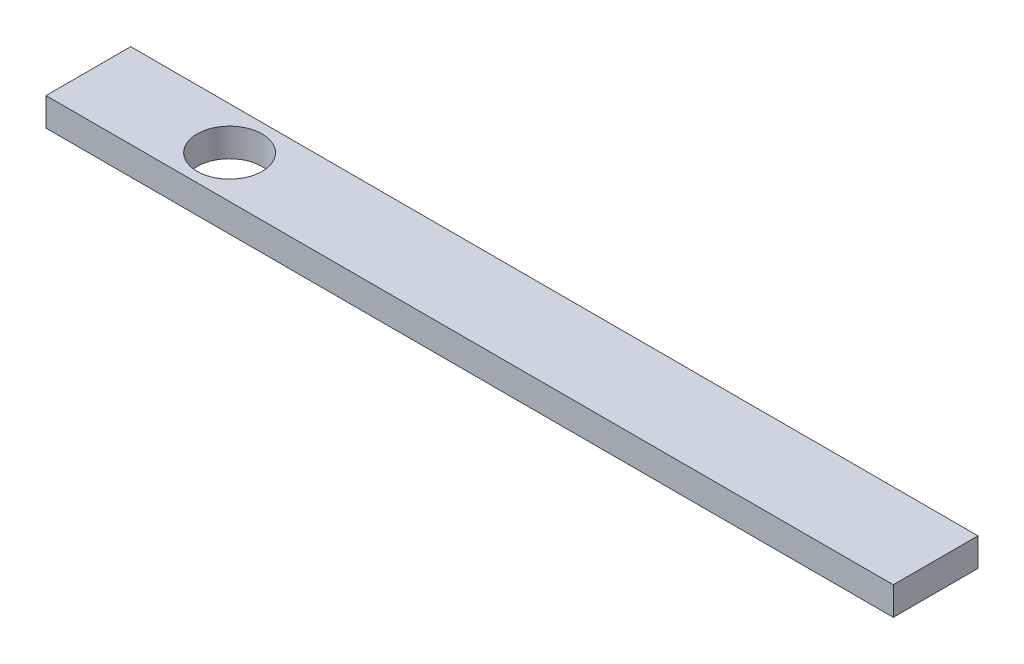
ISO-10303-21;
HEADER;
FILE_DESCRIPTION(('STEP AP214'),'2;1');
FILE_NAME('part.step','',(''),(''),'','','');
FILE_SCHEMA(('AUTOMOTIVE_DESIGN { 1 0 10303 214 1 1 1 1 }'));
ENDSEC;
DATA;
#1=APPLICATION_CONTEXT('core data for automotive mechanical design processes');
#2=APPLICATION_PROTOCOL_DEFINITION('international standard','automotive_design',2000,#1);
#3=PRODUCT_CONTEXT('',#1,'mechanical');
#4=PRODUCT('Part','Part','',(#3));
#5=PRODUCT_RELATED_PRODUCT_CATEGORY('part','',(#4));
#6=PRODUCT_DEFINITION_FORMATION('','',#4);
#7=PRODUCT_DEFINITION_CONTEXT('part definition',#1,'design');
#8=PRODUCT_DEFINITION('design','',#6,#7);
#9=PRODUCT_DEFINITION_SHAPE('','',#8);
#10=(LENGTH_UNIT() NAMED_UNIT(*) SI_UNIT(.MILLI.,.METRE.));
#11=(NAMED_UNIT(*) PLANE_ANGLE_UNIT() SI_UNIT($,.RADIAN.));
#12=(NAMED_UNIT(*) SI_UNIT($,.STERADIAN.) SOLID_ANGLE_UNIT());
#13=UNCERTAINTY_MEASURE_WITH_UNIT(LENGTH_MEASURE(1.E-05),#10,'distance_accuracy_value','');
#14=(GEOMETRIC_REPRESENTATION_CONTEXT(3) GLOBAL_UNCERTAINTY_ASSIGNED_CONTEXT((#13)) GLOBAL_UNIT_ASSIGNED_CONTEXT((#10,
#11,#12)) REPRESENTATION_CONTEXT('',''));
#15=CARTESIAN_POINT('',(0.,0.,0.));
#16=DIRECTION('',(0.,0.,1.));
#17=DIRECTION('',(1.,0.,0.));
#18=AXIS2_PLACEMENT_3D('',#15,#16,#17);
#19=CARTESIAN_POINT('',(0.,2.54,0.));
#20=DIRECTION('',(0.,1.,0.));
#21=DIRECTION('',(0.,0.,1.));
#22=AXIS2_PLACEMENT_3D('',#19,#20,#21);
#23=PLANE('',#22);
#24=DIRECTION('',(1.,0.,0.));
#25=VECTOR('',#24,1.);
#26=CARTESIAN_POINT('',(0.,2.54,0.));
#27=LINE('',#26,#25);
#28=CARTESIAN_POINT('',(0.,2.54,0.));
#29=VERTEX_POINT('',#28);
#30=CARTESIAN_POINT('',(76.2,2.54,0.));
#31=VERTEX_POINT('',#30);
#32=EDGE_CURVE('E85',#29,#31,#27,.T.);
#33=ORIENTED_EDGE('',*,*,#32,.T.);
#34=DIRECTION('',(0.,0.,-1.));
#35=VECTOR('',#34,1.);
#36=CARTESIAN_POINT('',(76.2,2.54,0.));
#37=LINE('',#36,#35);
#38=CARTESIAN_POINT('',(76.2,2.54,-7.62));
#39=VERTEX_POINT('',#38);
#40=EDGE_CURVE('E80',#31,#39,#37,.T.);
#41=ORIENTED_EDGE('',*,*,#40,.T.);
#42=DIRECTION('',(-1.,0.,0.));
#43=VECTOR('',#42,1.);
#44=CARTESIAN_POINT('',(0.,2.54,-7.62));
#45=LINE('',#44,#43);
#46=CARTESIAN_POINT('',(0.,2.54,-7.62));
#47=VERTEX_POINT('',#46);
#48=EDGE_CURVE('E83',#39,#47,#45,.T.);
#49=ORIENTED_EDGE('',*,*,#48,.T.);
#50=DIRECTION('',(0.,0.,1.));
#51=VECTOR('',#50,1.);
#52=CARTESIAN_POINT('',(0.,2.54,0.));
#53=LINE('',#52,#51);
#54=EDGE_CURVE('E50',#47,#29,#53,.T.);
#55=ORIENTED_EDGE('',*,*,#54,.T.);
#56=EDGE_LOOP('',(#33,#41,#49,#55));
#57=FACE_BOUND('',#56,.T.);
#58=CARTESIAN_POINT('',(12.7,2.54,-3.81));
#59=DIRECTION('',(0.,1.,0.));
#60=DIRECTION('',(0.,0.,1.));
#61=AXIS2_PLACEMENT_3D('',#58,#59,#60);
#62=CIRCLE('',#61,2.921);
#63=CARTESIAN_POINT('',(12.7,2.54,-0.888999999999999));
#64=VERTEX_POINT('',#63);
#65=EDGE_CURVE('E100',#64,#64,#62,.T.);
#66=ORIENTED_EDGE('',*,*,#65,.F.);
#67=EDGE_LOOP('',(#66));
#68=FACE_BOUND('',#67,.T.);
#69=ADVANCED_FACE('F33',(#57,#68),#23,.T.);
#70=CARTESIAN_POINT('',(0.,0.,0.));
#71=DIRECTION('',(0.,1.,0.));
#72=DIRECTION('',(0.,0.,1.));
#73=AXIS2_PLACEMENT_3D('',#70,#71,#72);
#74=PLANE('',#73);
#75=DIRECTION('',(1.,0.,0.));
#76=VECTOR('',#75,1.);
#77=CARTESIAN_POINT('',(0.,0.,0.));
#78=LINE('',#77,#76);
#79=CARTESIAN_POINT('',(0.,0.,0.));
#80=VERTEX_POINT('',#79);
#81=CARTESIAN_POINT('',(76.2,0.,0.));
#82=VERTEX_POINT('',#81);
#83=EDGE_CURVE('E97',#80,#82,#78,.T.);
#84=ORIENTED_EDGE('',*,*,#83,.F.);
#85=DIRECTION('',(0.,0.,1.));
#86=VECTOR('',#85,1.);
#87=CARTESIAN_POINT('',(0.,0.,0.));
#88=LINE('',#87,#86);
#89=CARTESIAN_POINT('',(0.,0.,-7.62));
#90=VERTEX_POINT('',#89);
#91=EDGE_CURVE('E73',#90,#80,#88,.T.);
#92=ORIENTED_EDGE('',*,*,#91,.F.);
#93=DIRECTION('',(-1.,0.,0.));
#94=VECTOR('',#93,1.);
#95=CARTESIAN_POINT('',(0.,0.,-7.62));
#96=LINE('',#95,#94);
#97=CARTESIAN_POINT('',(76.2,0.,-7.62));
#98=VERTEX_POINT('',#97);
#99=EDGE_CURVE('E67',#98,#90,#96,.T.);
#100=ORIENTED_EDGE('',*,*,#99,.F.);
#101=DIRECTION('',(0.,0.,-1.));
#102=VECTOR('',#101,1.);
#103=CARTESIAN_POINT('',(76.2,0.,0.));
#104=LINE('',#103,#102);
#105=EDGE_CURVE('E89',#82,#98,#104,.T.);
#106=ORIENTED_EDGE('',*,*,#105,.F.);
#107=EDGE_LOOP('',(#84,#92,#100,#106));
#108=FACE_BOUND('',#107,.T.);
#109=CARTESIAN_POINT('',(12.7,0.,-3.81));
#110=DIRECTION('',(0.,1.,0.));
#111=DIRECTION('',(0.,0.,1.));
#112=AXIS2_PLACEMENT_3D('',#109,#110,#111);
#113=CIRCLE('',#112,2.921);
#114=CARTESIAN_POINT('',(12.7,0.,-0.888999999999999));
#115=VERTEX_POINT('',#114);
#116=EDGE_CURVE('E112',#115,#115,#113,.T.);
#117=ORIENTED_EDGE('',*,*,#116,.T.);
#118=EDGE_LOOP('',(#117));
#119=FACE_BOUND('',#118,.T.);
#120=ADVANCED_FACE('F108',(#108,#119),#74,.F.);
#121=CARTESIAN_POINT('',(0.,2.54,0.));
#122=DIRECTION('',(0.,0.,-1.));
#123=DIRECTION('',(-1.,0.,0.));
#124=AXIS2_PLACEMENT_3D('',#121,#122,#123);
#125=PLANE('',#124);
#126=ORIENTED_EDGE('',*,*,#83,.T.);
#127=DIRECTION('',(0.,-1.,0.));
#128=VECTOR('',#127,1.);
#129=CARTESIAN_POINT('',(76.2,2.54,0.));
#130=LINE('',#129,#128);
#131=EDGE_CURVE('E11',#31,#82,#130,.T.);
#132=ORIENTED_EDGE('',*,*,#131,.F.);
#133=ORIENTED_EDGE('',*,*,#32,.F.);
#134=DIRECTION('',(0.,-1.,0.));
#135=VECTOR('',#134,1.);
#136=CARTESIAN_POINT('',(0.,2.54,0.));
#137=LINE('',#136,#135);
#138=EDGE_CURVE('E93',#29,#80,#137,.T.);
#139=ORIENTED_EDGE('',*,*,#138,.T.);
#140=EDGE_LOOP('',(#126,#132,#133,#139));
#141=FACE_BOUND('',#140,.T.);
#142=ADVANCED_FACE('F35',(#141),#125,.F.);
#143=CARTESIAN_POINT('',(76.2,2.54,0.));
#144=DIRECTION('',(-1.,0.,0.));
#145=DIRECTION('',(0.,0.,1.));
#146=AXIS2_PLACEMENT_3D('',#143,#144,#145);
#147=PLANE('',#146);
#148=ORIENTED_EDGE('',*,*,#105,.T.);
#149=DIRECTION('',(0.,-1.,0.));
#150=VECTOR('',#149,1.);
#151=CARTESIAN_POINT('',(76.2,2.54,-7.62));
#152=LINE('',#151,#150);
#153=EDGE_CURVE('E42',#39,#98,#152,.T.);
#154=ORIENTED_EDGE('',*,*,#153,.F.);
#155=ORIENTED_EDGE('',*,*,#40,.F.);
#156=ORIENTED_EDGE('',*,*,#131,.T.);
#157=EDGE_LOOP('',(#148,#154,#155,#156));
#158=FACE_BOUND('',#157,.T.);
#159=ADVANCED_FACE('F88',(#158),#147,.F.);
#160=CARTESIAN_POINT('',(0.,2.54,-7.62));
#161=DIRECTION('',(0.,0.,1.));
#162=DIRECTION('',(1.,0.,0.));
#163=AXIS2_PLACEMENT_3D('',#160,#161,#162);
#164=PLANE('',#163);
#165=ORIENTED_EDGE('',*,*,#99,.T.);
#166=DIRECTION('',(0.,-1.,0.));
#167=VECTOR('',#166,1.);
#168=CARTESIAN_POINT('',(0.,2.54,-7.62));
#169=LINE('',#168,#167);
#170=EDGE_CURVE('E90',#47,#90,#169,.T.);
#171=ORIENTED_EDGE('',*,*,#170,.F.);
#172=ORIENTED_EDGE('',*,*,#48,.F.);
#173=ORIENTED_EDGE('',*,*,#153,.T.);
#174=EDGE_LOOP('',(#165,#171,#172,#173));
#175=FACE_BOUND('',#174,.T.);
#176=ADVANCED_FACE('F91',(#175),#164,.F.);
#177=CARTESIAN_POINT('',(0.,2.54,0.));
#178=DIRECTION('',(1.,0.,0.));
#179=DIRECTION('',(0.,0.,-1.));
#180=AXIS2_PLACEMENT_3D('',#177,#178,#179);
#181=PLANE('',#180);
#182=ORIENTED_EDGE('',*,*,#91,.T.);
#183=ORIENTED_EDGE('',*,*,#138,.F.);
#184=ORIENTED_EDGE('',*,*,#54,.F.);
#185=ORIENTED_EDGE('',*,*,#170,.T.);
#186=EDGE_LOOP('',(#182,#183,#184,#185));
#187=FACE_BOUND('',#186,.T.);
#188=ADVANCED_FACE('F105',(#187),#181,.F.);
#189=CARTESIAN_POINT('',(12.7,2.54,-3.81));
#190=DIRECTION('',(0.,-1.,0.));
#191=DIRECTION('',(0.,0.,-1.));
#192=AXIS2_PLACEMENT_3D('',#189,#190,#191);
#193=CYLINDRICAL_SURFACE('',#192,2.921);
#194=ORIENTED_EDGE('',*,*,#65,.T.);
#195=EDGE_LOOP('',(#194));
#196=FACE_BOUND('',#195,.T.);
#197=ORIENTED_EDGE('',*,*,#116,.F.);
#198=EDGE_LOOP('',(#197));
#199=FACE_BOUND('',#198,.T.);
#200=ADVANCED_FACE('F118',(#196,#199),#193,.F.);
#201=CLOSED_SHELL('',(#69,#120,#142,#159,#176,#188,#200));
#202=MANIFOLD_SOLID_BREP('B2',#201);
#203=ADVANCED_BREP_SHAPE_REPRESENTATION('',(#18,#202),#14);
#204=SHAPE_DEFINITION_REPRESENTATION(#9,#203);
ENDSEC;
END-ISO-10303-21;
